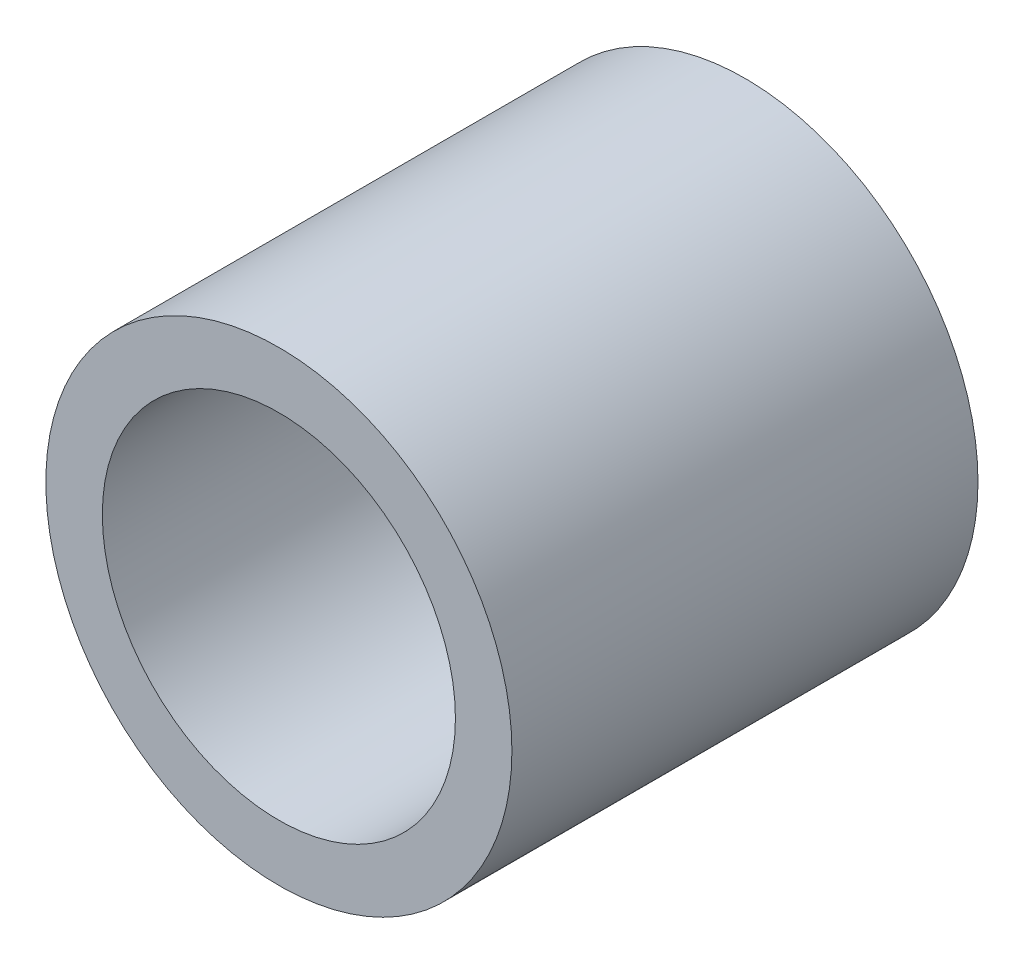
ISO-10303-21;
HEADER;
FILE_DESCRIPTION(('STEP AP214'),'2;1');
FILE_NAME('part.step','',(''),(''),'','','');
FILE_SCHEMA(('AUTOMOTIVE_DESIGN { 1 0 10303 214 1 1 1 1 }'));
ENDSEC;
DATA;
#1=APPLICATION_CONTEXT('core data for automotive mechanical design processes');
#2=APPLICATION_PROTOCOL_DEFINITION('international standard','automotive_design',2000,#1);
#3=PRODUCT_CONTEXT('',#1,'mechanical');
#4=PRODUCT('Part','Part','',(#3));
#5=PRODUCT_RELATED_PRODUCT_CATEGORY('part','',(#4));
#6=PRODUCT_DEFINITION_FORMATION('','',#4);
#7=PRODUCT_DEFINITION_CONTEXT('part definition',#1,'design');
#8=PRODUCT_DEFINITION('design','',#6,#7);
#9=PRODUCT_DEFINITION_SHAPE('','',#8);
#10=(LENGTH_UNIT() NAMED_UNIT(*) SI_UNIT(.MILLI.,.METRE.));
#11=(NAMED_UNIT(*) PLANE_ANGLE_UNIT() SI_UNIT($,.RADIAN.));
#12=(NAMED_UNIT(*) SI_UNIT($,.STERADIAN.) SOLID_ANGLE_UNIT());
#13=UNCERTAINTY_MEASURE_WITH_UNIT(LENGTH_MEASURE(1.E-05),#10,'distance_accuracy_value','');
#14=(GEOMETRIC_REPRESENTATION_CONTEXT(3) GLOBAL_UNCERTAINTY_ASSIGNED_CONTEXT((#13)) GLOBAL_UNIT_ASSIGNED_CONTEXT((#10,
#11,#12)) REPRESENTATION_CONTEXT('',''));
#15=CARTESIAN_POINT('',(0.,0.,0.));
#16=DIRECTION('',(0.,0.,1.));
#17=DIRECTION('',(1.,0.,0.));
#18=AXIS2_PLACEMENT_3D('',#15,#16,#17);
#19=CARTESIAN_POINT('',(0.,0.,16.5));
#20=DIRECTION('',(0.,0.,1.));
#21=DIRECTION('',(1.,0.,0.));
#22=AXIS2_PLACEMENT_3D('',#19,#20,#21);
#23=PLANE('',#22);
#24=CARTESIAN_POINT('',(0.,0.,16.5));
#25=DIRECTION('',(0.,0.,1.));
#26=DIRECTION('',(1.,0.,0.));
#27=AXIS2_PLACEMENT_3D('',#24,#25,#26);
#28=CIRCLE('',#27,8.25);
#29=CARTESIAN_POINT('',(8.25,0.,16.5));
#30=VERTEX_POINT('',#29);
#31=EDGE_CURVE('E10',#30,#30,#28,.T.);
#32=ORIENTED_EDGE('',*,*,#31,.T.);
#33=EDGE_LOOP('',(#32));
#34=FACE_BOUND('',#33,.T.);
#35=CARTESIAN_POINT('',(0.,0.,16.5));
#36=DIRECTION('',(0.,0.,1.));
#37=DIRECTION('',(1.,0.,0.));
#38=AXIS2_PLACEMENT_3D('',#35,#36,#37);
#39=CIRCLE('',#38,6.25);
#40=CARTESIAN_POINT('',(6.25,0.,16.5));
#41=VERTEX_POINT('',#40);
#42=EDGE_CURVE('E46',#41,#41,#39,.T.);
#43=ORIENTED_EDGE('',*,*,#42,.F.);
#44=EDGE_LOOP('',(#43));
#45=FACE_BOUND('',#44,.T.);
#46=ADVANCED_FACE('F35',(#34,#45),#23,.T.);
#47=CARTESIAN_POINT('',(0.,0.,0.));
#48=DIRECTION('',(0.,0.,1.));
#49=DIRECTION('',(1.,0.,0.));
#50=AXIS2_PLACEMENT_3D('',#47,#48,#49);
#51=PLANE('',#50);
#52=CARTESIAN_POINT('',(0.,0.,0.));
#53=DIRECTION('',(0.,0.,1.));
#54=DIRECTION('',(1.,0.,0.));
#55=AXIS2_PLACEMENT_3D('',#52,#53,#54);
#56=CIRCLE('',#55,8.25);
#57=CARTESIAN_POINT('',(8.25,0.,0.));
#58=VERTEX_POINT('',#57);
#59=EDGE_CURVE('E39',#58,#58,#56,.T.);
#60=ORIENTED_EDGE('',*,*,#59,.F.);
#61=EDGE_LOOP('',(#60));
#62=FACE_BOUND('',#61,.T.);
#63=CARTESIAN_POINT('',(0.,0.,0.));
#64=DIRECTION('',(0.,0.,1.));
#65=DIRECTION('',(1.,0.,0.));
#66=AXIS2_PLACEMENT_3D('',#63,#64,#65);
#67=CIRCLE('',#66,6.25);
#68=CARTESIAN_POINT('',(6.25,0.,0.));
#69=VERTEX_POINT('',#68);
#70=EDGE_CURVE('E48',#69,#69,#67,.T.);
#71=ORIENTED_EDGE('',*,*,#70,.T.);
#72=EDGE_LOOP('',(#71));
#73=FACE_BOUND('',#72,.T.);
#74=ADVANCED_FACE('F58',(#62,#73),#51,.F.);
#75=CARTESIAN_POINT('',(0.,0.,16.5));
#76=DIRECTION('',(0.,0.,-1.));
#77=DIRECTION('',(-1.,0.,0.));
#78=AXIS2_PLACEMENT_3D('',#75,#76,#77);
#79=CYLINDRICAL_SURFACE('',#78,8.25);
#80=ORIENTED_EDGE('',*,*,#31,.F.);
#81=EDGE_LOOP('',(#80));
#82=FACE_BOUND('',#81,.T.);
#83=ORIENTED_EDGE('',*,*,#59,.T.);
#84=EDGE_LOOP('',(#83));
#85=FACE_BOUND('',#84,.T.);
#86=ADVANCED_FACE('F37',(#82,#85),#79,.T.);
#87=CARTESIAN_POINT('',(0.,0.,16.5));
#88=DIRECTION('',(0.,0.,-1.));
#89=DIRECTION('',(-1.,0.,0.));
#90=AXIS2_PLACEMENT_3D('',#87,#88,#89);
#91=CYLINDRICAL_SURFACE('',#90,6.25);
#92=ORIENTED_EDGE('',*,*,#42,.T.);
#93=EDGE_LOOP('',(#92));
#94=FACE_BOUND('',#93,.T.);
#95=ORIENTED_EDGE('',*,*,#70,.F.);
#96=EDGE_LOOP('',(#95));
#97=FACE_BOUND('',#96,.T.);
#98=ADVANCED_FACE('F54',(#94,#97),#91,.F.);
#99=CLOSED_SHELL('',(#46,#74,#86,#98));
#100=MANIFOLD_SOLID_BREP('B2',#99);
#101=ADVANCED_BREP_SHAPE_REPRESENTATION('',(#18,#100),#14);
#102=SHAPE_DEFINITION_REPRESENTATION(#9,#101);
ENDSEC;
END-ISO-10303-21;
